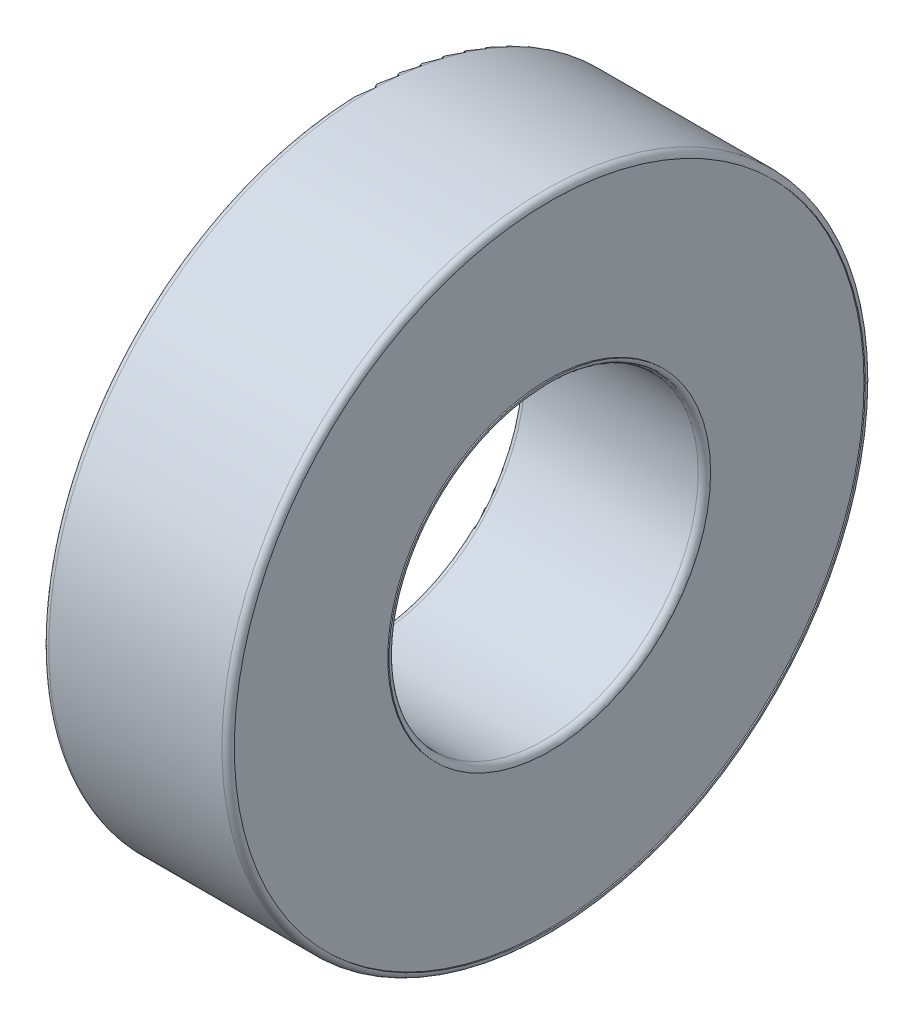
ISO-10303-21;
HEADER;
FILE_DESCRIPTION(('STEP AP214'),'2;1');
FILE_NAME('part.step','',(''),(''),'','','');
FILE_SCHEMA(('AUTOMOTIVE_DESIGN { 1 0 10303 214 1 1 1 1 }'));
ENDSEC;
DATA;
#1=APPLICATION_CONTEXT('core data for automotive mechanical design processes');
#2=APPLICATION_PROTOCOL_DEFINITION('international standard','automotive_design',2000,#1);
#3=PRODUCT_CONTEXT('',#1,'mechanical');
#4=PRODUCT('Part','Part','',(#3));
#5=PRODUCT_RELATED_PRODUCT_CATEGORY('part','',(#4));
#6=PRODUCT_DEFINITION_FORMATION('','',#4);
#7=PRODUCT_DEFINITION_CONTEXT('part definition',#1,'design');
#8=PRODUCT_DEFINITION('design','',#6,#7);
#9=PRODUCT_DEFINITION_SHAPE('','',#8);
#10=(LENGTH_UNIT() NAMED_UNIT(*) SI_UNIT(.MILLI.,.METRE.));
#11=(NAMED_UNIT(*) PLANE_ANGLE_UNIT() SI_UNIT($,.RADIAN.));
#12=(NAMED_UNIT(*) SI_UNIT($,.STERADIAN.) SOLID_ANGLE_UNIT());
#13=UNCERTAINTY_MEASURE_WITH_UNIT(LENGTH_MEASURE(1.E-05),#10,'distance_accuracy_value','');
#14=(GEOMETRIC_REPRESENTATION_CONTEXT(3) GLOBAL_UNCERTAINTY_ASSIGNED_CONTEXT((#13)) GLOBAL_UNIT_ASSIGNED_CONTEXT((#10,
#11,#12)) REPRESENTATION_CONTEXT('',''));
#15=CARTESIAN_POINT('',(0.,0.,0.));
#16=DIRECTION('',(0.,0.,1.));
#17=DIRECTION('',(1.,0.,0.));
#18=AXIS2_PLACEMENT_3D('',#15,#16,#17);
#19=CARTESIAN_POINT('',(15.,0.,0.));
#20=DIRECTION('',(-1.,0.,0.));
#21=DIRECTION('',(0.,0.,1.));
#22=AXIS2_PLACEMENT_3D('',#19,#20,#21);
#23=CYLINDRICAL_SURFACE('',#22,26.);
#24=CARTESIAN_POINT('',(0.5,0.,0.));
#25=DIRECTION('',(1.,0.,0.));
#26=DIRECTION('',(0.,0.,-1.));
#27=AXIS2_PLACEMENT_3D('',#24,#25,#26);
#28=CIRCLE('',#27,26.);
#29=CARTESIAN_POINT('',(0.5,0.,-26.));
#30=VERTEX_POINT('',#29);
#31=EDGE_CURVE('E49',#30,#30,#28,.T.);
#32=ORIENTED_EDGE('',*,*,#31,.T.);
#33=EDGE_LOOP('',(#32));
#34=FACE_BOUND('',#33,.T.);
#35=CARTESIAN_POINT('',(14.5,0.,0.));
#36=DIRECTION('',(1.,0.,0.));
#37=DIRECTION('',(0.,0.,-1.));
#38=AXIS2_PLACEMENT_3D('',#35,#36,#37);
#39=CIRCLE('',#38,26.);
#40=CARTESIAN_POINT('',(14.5,0.,-26.));
#41=VERTEX_POINT('',#40);
#42=EDGE_CURVE('E53',#41,#41,#39,.F.);
#43=ORIENTED_EDGE('',*,*,#42,.T.);
#44=EDGE_LOOP('',(#43));
#45=FACE_BOUND('',#44,.T.);
#46=ADVANCED_FACE('F34',(#34,#45),#23,.T.);
#47=CARTESIAN_POINT('',(15.,0.,0.));
#48=DIRECTION('',(-1.,0.,0.));
#49=DIRECTION('',(0.,0.,1.));
#50=AXIS2_PLACEMENT_3D('',#47,#48,#49);
#51=CYLINDRICAL_SURFACE('',#50,12.5);
#52=CARTESIAN_POINT('',(0.5,0.,0.));
#53=DIRECTION('',(1.,0.,0.));
#54=DIRECTION('',(0.,0.,-1.));
#55=AXIS2_PLACEMENT_3D('',#52,#53,#54);
#56=CIRCLE('',#55,12.5);
#57=CARTESIAN_POINT('',(0.5,0.,-12.5));
#58=VERTEX_POINT('',#57);
#59=EDGE_CURVE('E10',#58,#58,#56,.F.);
#60=ORIENTED_EDGE('',*,*,#59,.T.);
#61=EDGE_LOOP('',(#60));
#62=FACE_BOUND('',#61,.T.);
#63=CARTESIAN_POINT('',(14.5,0.,0.));
#64=DIRECTION('',(1.,0.,0.));
#65=DIRECTION('',(0.,0.,-1.));
#66=AXIS2_PLACEMENT_3D('',#63,#64,#65);
#67=CIRCLE('',#66,12.5);
#68=CARTESIAN_POINT('',(14.5,0.,-12.5));
#69=VERTEX_POINT('',#68);
#70=EDGE_CURVE('E42',#69,#69,#67,.T.);
#71=ORIENTED_EDGE('',*,*,#70,.T.);
#72=EDGE_LOOP('',(#71));
#73=FACE_BOUND('',#72,.T.);
#74=ADVANCED_FACE('F111',(#62,#73),#51,.F.);
#75=CARTESIAN_POINT('',(0.5,0.,0.));
#76=DIRECTION('',(1.,0.,0.));
#77=DIRECTION('',(0.,0.,-1.));
#78=AXIS2_PLACEMENT_3D('',#75,#76,#77);
#79=TOROIDAL_SURFACE('',#78,25.5,0.5);
#80=CARTESIAN_POINT('',(0.,0.,0.));
#81=DIRECTION('',(-1.,0.,0.));
#82=DIRECTION('',(0.,0.,1.));
#83=AXIS2_PLACEMENT_3D('',#80,#81,#82);
#84=CIRCLE('',#83,25.5);
#85=CARTESIAN_POINT('',(0.,0.,25.5));
#86=VERTEX_POINT('',#85);
#87=EDGE_CURVE('E59',#86,#86,#84,.T.);
#88=ORIENTED_EDGE('',*,*,#87,.F.);
#89=EDGE_LOOP('',(#88));
#90=FACE_BOUND('',#89,.T.);
#91=ORIENTED_EDGE('',*,*,#31,.F.);
#92=EDGE_LOOP('',(#91));
#93=FACE_BOUND('',#92,.T.);
#94=ADVANCED_FACE('F103',(#90,#93),#79,.T.);
#95=CARTESIAN_POINT('',(14.5,0.,0.));
#96=DIRECTION('',(1.,0.,0.));
#97=DIRECTION('',(0.,0.,-1.));
#98=AXIS2_PLACEMENT_3D('',#95,#96,#97);
#99=TOROIDAL_SURFACE('',#98,25.5,0.5);
#100=ORIENTED_EDGE('',*,*,#42,.F.);
#101=EDGE_LOOP('',(#100));
#102=FACE_BOUND('',#101,.T.);
#103=CARTESIAN_POINT('',(15.,0.,0.));
#104=DIRECTION('',(1.,0.,0.));
#105=DIRECTION('',(0.,0.,-1.));
#106=AXIS2_PLACEMENT_3D('',#103,#104,#105);
#107=CIRCLE('',#106,25.5);
#108=CARTESIAN_POINT('',(15.,0.,-25.5));
#109=VERTEX_POINT('',#108);
#110=EDGE_CURVE('E72',#109,#109,#107,.T.);
#111=ORIENTED_EDGE('',*,*,#110,.F.);
#112=EDGE_LOOP('',(#111));
#113=FACE_BOUND('',#112,.T.);
#114=ADVANCED_FACE('F100',(#102,#113),#99,.T.);
#115=CARTESIAN_POINT('',(0.5,0.,0.));
#116=DIRECTION('',(1.,0.,0.));
#117=DIRECTION('',(0.,0.,-1.));
#118=AXIS2_PLACEMENT_3D('',#115,#116,#117);
#119=TOROIDAL_SURFACE('',#118,13.,0.5);
#120=ORIENTED_EDGE('',*,*,#59,.F.);
#121=EDGE_LOOP('',(#120));
#122=FACE_BOUND('',#121,.T.);
#123=CARTESIAN_POINT('',(0.,0.,0.));
#124=DIRECTION('',(-1.,0.,0.));
#125=DIRECTION('',(0.,0.,1.));
#126=AXIS2_PLACEMENT_3D('',#123,#124,#125);
#127=CIRCLE('',#126,13.);
#128=CARTESIAN_POINT('',(0.,0.,13.));
#129=VERTEX_POINT('',#128);
#130=EDGE_CURVE('E66',#129,#129,#127,.T.);
#131=ORIENTED_EDGE('',*,*,#130,.T.);
#132=EDGE_LOOP('',(#131));
#133=FACE_BOUND('',#132,.T.);
#134=ADVANCED_FACE('F102',(#122,#133),#119,.T.);
#135=CARTESIAN_POINT('',(14.5,0.,0.));
#136=DIRECTION('',(1.,0.,0.));
#137=DIRECTION('',(0.,0.,-1.));
#138=AXIS2_PLACEMENT_3D('',#135,#136,#137);
#139=TOROIDAL_SURFACE('',#138,13.,0.5);
#140=CARTESIAN_POINT('',(15.,0.,0.));
#141=DIRECTION('',(1.,0.,0.));
#142=DIRECTION('',(0.,0.,-1.));
#143=AXIS2_PLACEMENT_3D('',#140,#141,#142);
#144=CIRCLE('',#143,13.);
#145=CARTESIAN_POINT('',(15.,0.,-13.));
#146=VERTEX_POINT('',#145);
#147=EDGE_CURVE('E78',#146,#146,#144,.T.);
#148=ORIENTED_EDGE('',*,*,#147,.T.);
#149=EDGE_LOOP('',(#148));
#150=FACE_BOUND('',#149,.T.);
#151=ORIENTED_EDGE('',*,*,#70,.F.);
#152=EDGE_LOOP('',(#151));
#153=FACE_BOUND('',#152,.T.);
#154=ADVANCED_FACE('F36',(#150,#153),#139,.T.);
#155=CARTESIAN_POINT('',(0.1,0.,0.));
#156=DIRECTION('',(-1.,0.,0.));
#157=DIRECTION('',(0.,0.,1.));
#158=AXIS2_PLACEMENT_3D('',#155,#156,#157);
#159=CYLINDRICAL_SURFACE('',#158,25.5);
#160=CARTESIAN_POINT('',(0.1,0.,0.));
#161=DIRECTION('',(-1.,0.,0.));
#162=DIRECTION('',(0.,0.,1.));
#163=AXIS2_PLACEMENT_3D('',#160,#161,#162);
#164=CIRCLE('',#163,25.5);
#165=CARTESIAN_POINT('',(0.1,0.,25.5));
#166=VERTEX_POINT('',#165);
#167=EDGE_CURVE('E58',#166,#166,#164,.T.);
#168=ORIENTED_EDGE('',*,*,#167,.F.);
#169=EDGE_LOOP('',(#168));
#170=FACE_BOUND('',#169,.T.);
#171=ORIENTED_EDGE('',*,*,#87,.T.);
#172=EDGE_LOOP('',(#171));
#173=FACE_BOUND('',#172,.T.);
#174=ADVANCED_FACE('F124',(#170,#173),#159,.F.);
#175=CARTESIAN_POINT('',(0.1,0.,0.));
#176=DIRECTION('',(-1.,0.,0.));
#177=DIRECTION('',(0.,0.,1.));
#178=AXIS2_PLACEMENT_3D('',#175,#176,#177);
#179=PLANE('',#178);
#180=CARTESIAN_POINT('',(0.1,0.,0.));
#181=DIRECTION('',(-1.,0.,0.));
#182=DIRECTION('',(0.,0.,1.));
#183=AXIS2_PLACEMENT_3D('',#180,#181,#182);
#184=CIRCLE('',#183,13.);
#185=CARTESIAN_POINT('',(0.1,0.,13.));
#186=VERTEX_POINT('',#185);
#187=EDGE_CURVE('E63',#186,#186,#184,.T.);
#188=ORIENTED_EDGE('',*,*,#187,.F.);
#189=EDGE_LOOP('',(#188));
#190=FACE_BOUND('',#189,.T.);
#191=ORIENTED_EDGE('',*,*,#167,.T.);
#192=EDGE_LOOP('',(#191));
#193=FACE_BOUND('',#192,.T.);
#194=ADVANCED_FACE('F127',(#190,#193),#179,.T.);
#195=CARTESIAN_POINT('',(0.1,0.,0.));
#196=DIRECTION('',(-1.,0.,0.));
#197=DIRECTION('',(0.,0.,1.));
#198=AXIS2_PLACEMENT_3D('',#195,#196,#197);
#199=CYLINDRICAL_SURFACE('',#198,13.);
#200=ORIENTED_EDGE('',*,*,#187,.T.);
#201=EDGE_LOOP('',(#200));
#202=FACE_BOUND('',#201,.T.);
#203=ORIENTED_EDGE('',*,*,#130,.F.);
#204=EDGE_LOOP('',(#203));
#205=FACE_BOUND('',#204,.T.);
#206=ADVANCED_FACE('F96',(#202,#205),#199,.T.);
#207=CARTESIAN_POINT('',(14.9,0.,0.));
#208=DIRECTION('',(1.,0.,0.));
#209=DIRECTION('',(0.,0.,-1.));
#210=AXIS2_PLACEMENT_3D('',#207,#208,#209);
#211=CYLINDRICAL_SURFACE('',#210,25.5);
#212=CARTESIAN_POINT('',(14.9,0.,0.));
#213=DIRECTION('',(1.,0.,0.));
#214=DIRECTION('',(0.,0.,-1.));
#215=AXIS2_PLACEMENT_3D('',#212,#213,#214);
#216=CIRCLE('',#215,25.5);
#217=CARTESIAN_POINT('',(14.9,0.,-25.5));
#218=VERTEX_POINT('',#217);
#219=EDGE_CURVE('E69',#218,#218,#216,.T.);
#220=ORIENTED_EDGE('',*,*,#219,.F.);
#221=EDGE_LOOP('',(#220));
#222=FACE_BOUND('',#221,.T.);
#223=ORIENTED_EDGE('',*,*,#110,.T.);
#224=EDGE_LOOP('',(#223));
#225=FACE_BOUND('',#224,.T.);
#226=ADVANCED_FACE('F90',(#222,#225),#211,.F.);
#227=CARTESIAN_POINT('',(14.9,0.,0.));
#228=DIRECTION('',(1.,0.,0.));
#229=DIRECTION('',(0.,0.,-1.));
#230=AXIS2_PLACEMENT_3D('',#227,#228,#229);
#231=PLANE('',#230);
#232=CARTESIAN_POINT('',(14.9,0.,0.));
#233=DIRECTION('',(1.,0.,0.));
#234=DIRECTION('',(0.,0.,-1.));
#235=AXIS2_PLACEMENT_3D('',#232,#233,#234);
#236=CIRCLE('',#235,13.);
#237=CARTESIAN_POINT('',(14.9,0.,-13.));
#238=VERTEX_POINT('',#237);
#239=EDGE_CURVE('E75',#238,#238,#236,.T.);
#240=ORIENTED_EDGE('',*,*,#239,.F.);
#241=EDGE_LOOP('',(#240));
#242=FACE_BOUND('',#241,.T.);
#243=ORIENTED_EDGE('',*,*,#219,.T.);
#244=EDGE_LOOP('',(#243));
#245=FACE_BOUND('',#244,.T.);
#246=ADVANCED_FACE('F87',(#242,#245),#231,.T.);
#247=CARTESIAN_POINT('',(14.9,0.,0.));
#248=DIRECTION('',(1.,0.,0.));
#249=DIRECTION('',(0.,0.,-1.));
#250=AXIS2_PLACEMENT_3D('',#247,#248,#249);
#251=CYLINDRICAL_SURFACE('',#250,13.);
#252=ORIENTED_EDGE('',*,*,#239,.T.);
#253=EDGE_LOOP('',(#252));
#254=FACE_BOUND('',#253,.T.);
#255=ORIENTED_EDGE('',*,*,#147,.F.);
#256=EDGE_LOOP('',(#255));
#257=FACE_BOUND('',#256,.T.);
#258=ADVANCED_FACE('F84',(#254,#257),#251,.T.);
#259=CLOSED_SHELL('',(#46,#74,#94,#114,#134,#154,#174,#194,#206,#226,#246,#258));
#260=MANIFOLD_SOLID_BREP('B2',#259);
#261=ADVANCED_BREP_SHAPE_REPRESENTATION('',(#18,#260),#14);
#262=SHAPE_DEFINITION_REPRESENTATION(#9,#261);
ENDSEC;
END-ISO-10303-21;
